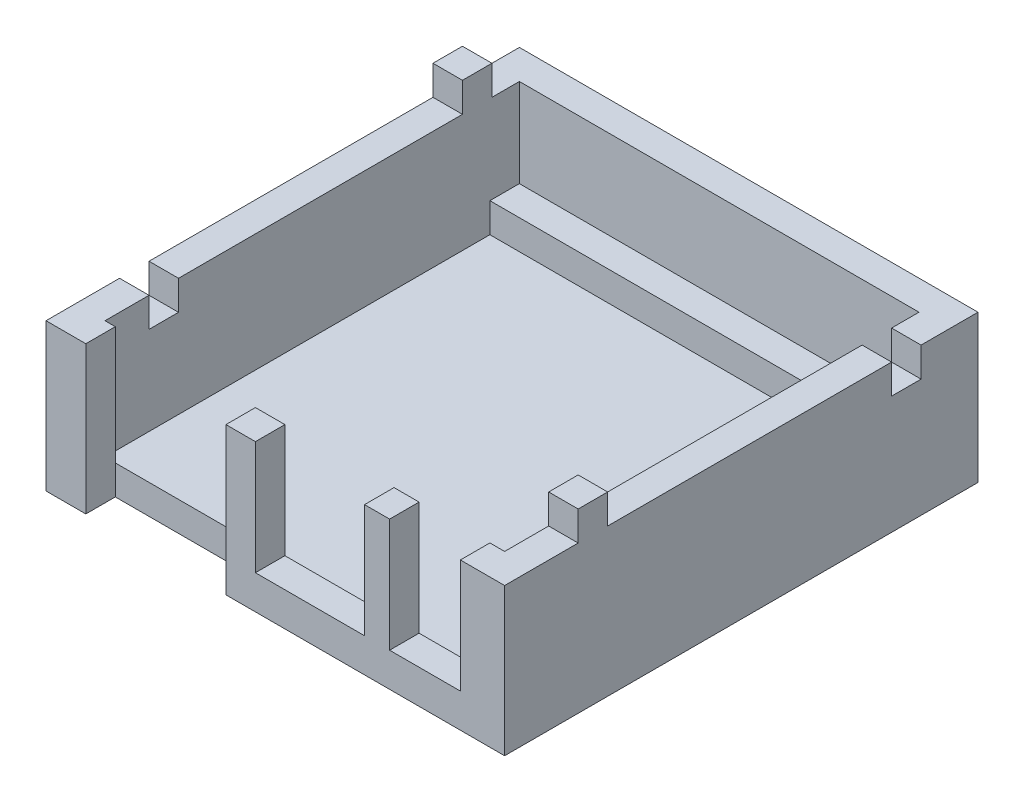
ISO-10303-21;
HEADER;
FILE_DESCRIPTION(('STEP AP214'),'2;1');
FILE_NAME('part.step','',(''),(''),'','','');
FILE_SCHEMA(('AUTOMOTIVE_DESIGN { 1 0 10303 214 1 1 1 1 }'));
ENDSEC;
DATA;
#1=APPLICATION_CONTEXT('core data for automotive mechanical design processes');
#2=APPLICATION_PROTOCOL_DEFINITION('international standard','automotive_design',2000,#1);
#3=PRODUCT_CONTEXT('',#1,'mechanical');
#4=PRODUCT('Part','Part','',(#3));
#5=PRODUCT_RELATED_PRODUCT_CATEGORY('part','',(#4));
#6=PRODUCT_DEFINITION_FORMATION('','',#4);
#7=PRODUCT_DEFINITION_CONTEXT('part definition',#1,'design');
#8=PRODUCT_DEFINITION('design','',#6,#7);
#9=PRODUCT_DEFINITION_SHAPE('','',#8);
#10=(LENGTH_UNIT() NAMED_UNIT(*) SI_UNIT(.MILLI.,.METRE.));
#11=(NAMED_UNIT(*) PLANE_ANGLE_UNIT() SI_UNIT($,.RADIAN.));
#12=(NAMED_UNIT(*) SI_UNIT($,.STERADIAN.) SOLID_ANGLE_UNIT());
#13=UNCERTAINTY_MEASURE_WITH_UNIT(LENGTH_MEASURE(1.E-05),#10,'distance_accuracy_value','');
#14=(GEOMETRIC_REPRESENTATION_CONTEXT(3) GLOBAL_UNCERTAINTY_ASSIGNED_CONTEXT((#13)) GLOBAL_UNIT_ASSIGNED_CONTEXT((#10,
#11,#12)) REPRESENTATION_CONTEXT('',''));
#15=CARTESIAN_POINT('',(0.,0.,0.));
#16=DIRECTION('',(0.,0.,1.));
#17=DIRECTION('',(1.,0.,0.));
#18=AXIS2_PLACEMENT_3D('',#15,#16,#17);
#19=CARTESIAN_POINT('',(0.,10.,0.));
#20=DIRECTION('',(0.,1.,0.));
#21=DIRECTION('',(0.,0.,1.));
#22=AXIS2_PLACEMENT_3D('',#19,#20,#21);
#23=PLANE('',#22);
#24=DIRECTION('',(-1.,0.,0.));
#25=VECTOR('',#24,1.);
#26=CARTESIAN_POINT('',(0.,10.,25.1129881214165));
#27=LINE('',#26,#25);
#28=CARTESIAN_POINT('',(2.,10.,25.1129881214165));
#29=VERTEX_POINT('',#28);
#30=CARTESIAN_POINT('',(0.,10.,25.1129881214165));
#31=VERTEX_POINT('',#30);
#32=EDGE_CURVE('E329',#29,#31,#27,.T.);
#33=ORIENTED_EDGE('',*,*,#32,.F.);
#34=DIRECTION('',(0.,0.,1.));
#35=VECTOR('',#34,1.);
#36=CARTESIAN_POINT('',(2.,10.,4.));
#37=LINE('',#36,#35);
#38=CARTESIAN_POINT('',(2.,10.,5.85974229873187));
#39=VERTEX_POINT('',#38);
#40=EDGE_CURVE('E570',#39,#29,#37,.T.);
#41=ORIENTED_EDGE('',*,*,#40,.F.);
#42=DIRECTION('',(1.,0.,0.));
#43=VECTOR('',#42,1.);
#44=CARTESIAN_POINT('',(0.,10.,5.85974229873187));
#45=LINE('',#44,#43);
#46=CARTESIAN_POINT('',(0.,10.,5.85974229873187));
#47=VERTEX_POINT('',#46);
#48=EDGE_CURVE('E374',#47,#39,#45,.T.);
#49=ORIENTED_EDGE('',*,*,#48,.F.);
#50=DIRECTION('',(0.,0.,1.));
#51=VECTOR('',#50,1.);
#52=CARTESIAN_POINT('',(0.,10.,0.));
#53=LINE('',#52,#51);
#54=EDGE_CURVE('E607',#47,#31,#53,.T.);
#55=ORIENTED_EDGE('',*,*,#54,.T.);
#56=EDGE_LOOP('',(#33,#41,#49,#55));
#57=FACE_BOUND('',#56,.T.);
#58=ADVANCED_FACE('F42',(#57),#23,.T.);
#59=DIRECTION('',(-1.,0.,0.));
#60=VECTOR('',#59,1.);
#61=CARTESIAN_POINT('',(29.1,10.,3.85974229873187));
#62=LINE('',#61,#60);
#63=CARTESIAN_POINT('',(31.1,10.,3.85974229873187));
#64=VERTEX_POINT('',#63);
#65=CARTESIAN_POINT('',(29.1,10.,3.85974229873187));
#66=VERTEX_POINT('',#65);
#67=EDGE_CURVE('E311',#64,#66,#62,.T.);
#68=ORIENTED_EDGE('',*,*,#67,.F.);
#69=DIRECTION('',(0.,0.,-1.));
#70=VECTOR('',#69,1.);
#71=CARTESIAN_POINT('',(31.1,10.,0.));
#72=LINE('',#71,#70);
#73=CARTESIAN_POINT('',(31.1,10.,0.));
#74=VERTEX_POINT('',#73);
#75=EDGE_CURVE('E613',#64,#74,#72,.T.);
#76=ORIENTED_EDGE('',*,*,#75,.T.);
#77=DIRECTION('',(-1.,0.,0.));
#78=VECTOR('',#77,1.);
#79=CARTESIAN_POINT('',(0.,10.,0.));
#80=LINE('',#79,#78);
#81=CARTESIAN_POINT('',(0.,10.,0.));
#82=VERTEX_POINT('',#81);
#83=EDGE_CURVE('E619',#74,#82,#80,.T.);
#84=ORIENTED_EDGE('',*,*,#83,.T.);
#85=CARTESIAN_POINT('',(0.,10.,3.85974229873187));
#86=VERTEX_POINT('',#85);
#87=EDGE_CURVE('E602',#82,#86,#53,.T.);
#88=ORIENTED_EDGE('',*,*,#87,.T.);
#89=DIRECTION('',(-1.,0.,0.));
#90=VECTOR('',#89,1.);
#91=CARTESIAN_POINT('',(0.,10.,3.85974229873187));
#92=LINE('',#91,#90);
#93=CARTESIAN_POINT('',(2.,10.,3.85974229873187));
#94=VERTEX_POINT('',#93);
#95=EDGE_CURVE('E364',#94,#86,#92,.T.);
#96=ORIENTED_EDGE('',*,*,#95,.F.);
#97=CARTESIAN_POINT('',(2.,10.,2.));
#98=VERTEX_POINT('',#97);
#99=EDGE_CURVE('E565',#98,#94,#37,.T.);
#100=ORIENTED_EDGE('',*,*,#99,.F.);
#101=DIRECTION('',(-1.,0.,0.));
#102=VECTOR('',#101,1.);
#103=CARTESIAN_POINT('',(2.,10.,2.));
#104=LINE('',#103,#102);
#105=CARTESIAN_POINT('',(29.1,10.,2.));
#106=VERTEX_POINT('',#105);
#107=EDGE_CURVE('E462',#106,#98,#104,.T.);
#108=ORIENTED_EDGE('',*,*,#107,.F.);
#109=DIRECTION('',(0.,0.,-1.));
#110=VECTOR('',#109,1.);
#111=CARTESIAN_POINT('',(29.1,10.,4.));
#112=LINE('',#111,#110);
#113=EDGE_CURVE('E575',#66,#106,#112,.T.);
#114=ORIENTED_EDGE('',*,*,#113,.F.);
#115=EDGE_LOOP('',(#68,#76,#84,#88,#96,#100,#108,#114));
#116=FACE_BOUND('',#115,.T.);
#117=ADVANCED_FACE('F674',(#116),#23,.T.);
#118=DIRECTION('',(1.,0.,0.));
#119=VECTOR('',#118,1.);
#120=CARTESIAN_POINT('',(0.,10.,27.1129881214165));
#121=LINE('',#120,#119);
#122=CARTESIAN_POINT('',(0.,10.,27.1129881214165));
#123=VERTEX_POINT('',#122);
#124=CARTESIAN_POINT('',(2.,10.,27.1129881214165));
#125=VERTEX_POINT('',#124);
#126=EDGE_CURVE('E340',#123,#125,#121,.T.);
#127=ORIENTED_EDGE('',*,*,#126,.F.);
#128=CARTESIAN_POINT('',(0.,10.,32.1));
#129=VERTEX_POINT('',#128);
#130=EDGE_CURVE('E608',#123,#129,#53,.T.);
#131=ORIENTED_EDGE('',*,*,#130,.T.);
#132=DIRECTION('',(1.,0.,0.));
#133=VECTOR('',#132,1.);
#134=CARTESIAN_POINT('',(0.,10.,32.1));
#135=LINE('',#134,#133);
#136=CARTESIAN_POINT('',(2.7,9.99999999999999,32.1));
#137=VERTEX_POINT('',#136);
#138=EDGE_CURVE('E609',#129,#137,#135,.T.);
#139=ORIENTED_EDGE('',*,*,#138,.T.);
#140=DIRECTION('',(0.,0.,1.));
#141=VECTOR('',#140,1.);
#142=CARTESIAN_POINT('',(2.7,9.99999999999999,16.3068857758663));
#143=LINE('',#142,#141);
#144=CARTESIAN_POINT('',(2.7,9.99999999999999,30.1));
#145=VERTEX_POINT('',#144);
#146=EDGE_CURVE('E522',#145,#137,#143,.T.);
#147=ORIENTED_EDGE('',*,*,#146,.F.);
#148=DIRECTION('',(1.,0.,0.));
#149=VECTOR('',#148,1.);
#150=CARTESIAN_POINT('',(2.,10.,30.1));
#151=LINE('',#150,#149);
#152=CARTESIAN_POINT('',(2.,10.,30.1));
#153=VERTEX_POINT('',#152);
#154=EDGE_CURVE('E571',#153,#145,#151,.T.);
#155=ORIENTED_EDGE('',*,*,#154,.F.);
#156=EDGE_CURVE('E553',#125,#153,#37,.T.);
#157=ORIENTED_EDGE('',*,*,#156,.F.);
#158=EDGE_LOOP('',(#127,#131,#139,#147,#155,#157));
#159=FACE_BOUND('',#158,.T.);
#160=ADVANCED_FACE('F779',(#159),#23,.T.);
#161=DIRECTION('',(1.,0.,0.));
#162=VECTOR('',#161,1.);
#163=CARTESIAN_POINT('',(29.1,10.,5.85974229873187));
#164=LINE('',#163,#162);
#165=CARTESIAN_POINT('',(29.1,10.,5.85974229873187));
#166=VERTEX_POINT('',#165);
#167=CARTESIAN_POINT('',(31.1,10.,5.85974229873187));
#168=VERTEX_POINT('',#167);
#169=EDGE_CURVE('E349',#166,#168,#164,.T.);
#170=ORIENTED_EDGE('',*,*,#169,.F.);
#171=CARTESIAN_POINT('',(29.1,10.,25.1129881214165));
#172=VERTEX_POINT('',#171);
#173=EDGE_CURVE('E316',#172,#166,#112,.T.);
#174=ORIENTED_EDGE('',*,*,#173,.F.);
#175=DIRECTION('',(-1.,0.,0.));
#176=VECTOR('',#175,1.);
#177=CARTESIAN_POINT('',(29.1,10.,25.1129881214165));
#178=LINE('',#177,#176);
#179=CARTESIAN_POINT('',(31.1,10.,25.1129881214165));
#180=VERTEX_POINT('',#179);
#181=EDGE_CURVE('E399',#180,#172,#178,.T.);
#182=ORIENTED_EDGE('',*,*,#181,.F.);
#183=EDGE_CURVE('E620',#180,#168,#72,.T.);
#184=ORIENTED_EDGE('',*,*,#183,.T.);
#185=EDGE_LOOP('',(#170,#174,#182,#184));
#186=FACE_BOUND('',#185,.T.);
#187=ADVANCED_FACE('F683',(#186),#23,.T.);
#188=CARTESIAN_POINT('',(31.1,10.,32.1));
#189=VERTEX_POINT('',#188);
#190=CARTESIAN_POINT('',(31.1,10.,27.1129881214165));
#191=VERTEX_POINT('',#190);
#192=EDGE_CURVE('E615',#189,#191,#72,.T.);
#193=ORIENTED_EDGE('',*,*,#192,.T.);
#194=DIRECTION('',(1.,0.,0.));
#195=VECTOR('',#194,1.);
#196=CARTESIAN_POINT('',(29.1,10.,27.1129881214165));
#197=LINE('',#196,#195);
#198=CARTESIAN_POINT('',(29.1,10.,27.1129881214165));
#199=VERTEX_POINT('',#198);
#200=EDGE_CURVE('E393',#199,#191,#197,.T.);
#201=ORIENTED_EDGE('',*,*,#200,.F.);
#202=CARTESIAN_POINT('',(29.1,10.,30.1));
#203=VERTEX_POINT('',#202);
#204=EDGE_CURVE('E577',#203,#199,#112,.T.);
#205=ORIENTED_EDGE('',*,*,#204,.F.);
#206=CARTESIAN_POINT('',(28.1,10.,30.1));
#207=VERTEX_POINT('',#206);
#208=EDGE_CURVE('E569',#207,#203,#151,.T.);
#209=ORIENTED_EDGE('',*,*,#208,.F.);
#210=DIRECTION('',(0.,0.,1.));
#211=VECTOR('',#210,1.);
#212=CARTESIAN_POINT('',(28.1,10.,16.3068857758663));
#213=LINE('',#212,#211);
#214=CARTESIAN_POINT('',(28.1,10.,32.1));
#215=VERTEX_POINT('',#214);
#216=EDGE_CURVE('E451',#207,#215,#213,.T.);
#217=ORIENTED_EDGE('',*,*,#216,.T.);
#218=EDGE_CURVE('E606',#215,#189,#135,.T.);
#219=ORIENTED_EDGE('',*,*,#218,.T.);
#220=EDGE_LOOP('',(#193,#201,#205,#209,#217,#219));
#221=FACE_BOUND('',#220,.T.);
#222=ADVANCED_FACE('F753',(#221),#23,.T.);
#223=CARTESIAN_POINT('',(0.,10.,32.1));
#224=DIRECTION('',(0.,0.,-1.));
#225=DIRECTION('',(-1.,0.,0.));
#226=AXIS2_PLACEMENT_3D('',#223,#224,#225);
#227=PLANE('',#226);
#228=DIRECTION('',(1.,0.,0.));
#229=VECTOR('',#228,1.);
#230=CARTESIAN_POINT('',(23.3,2.3,32.1));
#231=LINE('',#230,#229);
#232=CARTESIAN_POINT('',(23.3,2.3,32.1));
#233=VERTEX_POINT('',#232);
#234=CARTESIAN_POINT('',(28.1,2.3,32.1));
#235=VERTEX_POINT('',#234);
#236=EDGE_CURVE('E440',#233,#235,#231,.T.);
#237=ORIENTED_EDGE('',*,*,#236,.F.);
#238=DIRECTION('',(0.,-1.,0.));
#239=VECTOR('',#238,1.);
#240=CARTESIAN_POINT('',(23.3,10.,32.1));
#241=LINE('',#240,#239);
#242=CARTESIAN_POINT('',(23.3,10.,32.1));
#243=VERTEX_POINT('',#242);
#244=EDGE_CURVE('E436',#243,#233,#241,.T.);
#245=ORIENTED_EDGE('',*,*,#244,.F.);
#246=CARTESIAN_POINT('',(21.6,10.,32.1));
#247=VERTEX_POINT('',#246);
#248=EDGE_CURVE('E710',#247,#243,#135,.T.);
#249=ORIENTED_EDGE('',*,*,#248,.F.);
#250=DIRECTION('',(0.,1.,0.));
#251=VECTOR('',#250,1.);
#252=CARTESIAN_POINT('',(21.6,2.3,32.1));
#253=LINE('',#252,#251);
#254=CARTESIAN_POINT('',(21.6,2.3,32.1));
#255=VERTEX_POINT('',#254);
#256=EDGE_CURVE('E480',#255,#247,#253,.T.);
#257=ORIENTED_EDGE('',*,*,#256,.F.);
#258=DIRECTION('',(1.,0.,0.));
#259=VECTOR('',#258,1.);
#260=CARTESIAN_POINT('',(14.2,2.3,32.1));
#261=LINE('',#260,#259);
#262=CARTESIAN_POINT('',(14.2,2.3,32.1));
#263=VERTEX_POINT('',#262);
#264=EDGE_CURVE('E475',#263,#255,#261,.T.);
#265=ORIENTED_EDGE('',*,*,#264,.F.);
#266=DIRECTION('',(0.,-1.,0.));
#267=VECTOR('',#266,1.);
#268=CARTESIAN_POINT('',(14.2,2.3,32.1));
#269=LINE('',#268,#267);
#270=CARTESIAN_POINT('',(14.2,10.,32.1));
#271=VERTEX_POINT('',#270);
#272=EDGE_CURVE('E471',#271,#263,#269,.T.);
#273=ORIENTED_EDGE('',*,*,#272,.F.);
#274=CARTESIAN_POINT('',(12.2,10.,32.1));
#275=VERTEX_POINT('',#274);
#276=EDGE_CURVE('E614',#275,#271,#135,.T.);
#277=ORIENTED_EDGE('',*,*,#276,.F.);
#278=DIRECTION('',(0.,1.,0.));
#279=VECTOR('',#278,1.);
#280=CARTESIAN_POINT('',(12.2,0.,32.1));
#281=LINE('',#280,#279);
#282=CARTESIAN_POINT('',(12.2,0.,32.1));
#283=VERTEX_POINT('',#282);
#284=EDGE_CURVE('E426',#283,#275,#281,.T.);
#285=ORIENTED_EDGE('',*,*,#284,.F.);
#286=DIRECTION('',(1.,0.,0.));
#287=VECTOR('',#286,1.);
#288=CARTESIAN_POINT('',(0.,0.,32.1));
#289=LINE('',#288,#287);
#290=CARTESIAN_POINT('',(31.1,0.,32.1));
#291=VERTEX_POINT('',#290);
#292=EDGE_CURVE('E627',#283,#291,#289,.T.);
#293=ORIENTED_EDGE('',*,*,#292,.T.);
#294=DIRECTION('',(0.,-1.,0.));
#295=VECTOR('',#294,1.);
#296=CARTESIAN_POINT('',(31.1,10.,32.1));
#297=LINE('',#296,#295);
#298=EDGE_CURVE('E51',#189,#291,#297,.T.);
#299=ORIENTED_EDGE('',*,*,#298,.F.);
#300=ORIENTED_EDGE('',*,*,#218,.F.);
#301=DIRECTION('',(0.,1.,0.));
#302=VECTOR('',#301,1.);
#303=CARTESIAN_POINT('',(28.1,2.3,32.1));
#304=LINE('',#303,#302);
#305=EDGE_CURVE('E445',#235,#215,#304,.T.);
#306=ORIENTED_EDGE('',*,*,#305,.F.);
#307=EDGE_LOOP('',(#237,#245,#249,#257,#265,#273,#277,#285,#293,#299,#300,#306));
#308=FACE_BOUND('',#307,.T.);
#309=ADVANCED_FACE('F723',(#308),#227,.F.);
#310=DIRECTION('',(0.,0.,1.));
#311=VECTOR('',#310,1.);
#312=CARTESIAN_POINT('',(23.3,10.,16.3068857758663));
#313=LINE('',#312,#311);
#314=CARTESIAN_POINT('',(23.3,10.,30.1));
#315=VERTEX_POINT('',#314);
#316=EDGE_CURVE('E432',#315,#243,#313,.T.);
#317=ORIENTED_EDGE('',*,*,#316,.F.);
#318=CARTESIAN_POINT('',(21.6,10.,30.1));
#319=VERTEX_POINT('',#318);
#320=EDGE_CURVE('E737',#319,#315,#151,.T.);
#321=ORIENTED_EDGE('',*,*,#320,.F.);
#322=DIRECTION('',(0.,0.,1.));
#323=VECTOR('',#322,1.);
#324=CARTESIAN_POINT('',(21.6,10.,16.3068857758663));
#325=LINE('',#324,#323);
#326=EDGE_CURVE('E486',#319,#247,#325,.T.);
#327=ORIENTED_EDGE('',*,*,#326,.T.);
#328=ORIENTED_EDGE('',*,*,#248,.T.);
#329=EDGE_LOOP('',(#317,#321,#327,#328));
#330=FACE_BOUND('',#329,.T.);
#331=ADVANCED_FACE('F788',(#330),#23,.T.);
#332=DIRECTION('',(0.,0.,1.));
#333=VECTOR('',#332,1.);
#334=CARTESIAN_POINT('',(14.2,10.,16.3068857758663));
#335=LINE('',#334,#333);
#336=CARTESIAN_POINT('',(14.2,10.,30.1));
#337=VERTEX_POINT('',#336);
#338=EDGE_CURVE('E468',#337,#271,#335,.T.);
#339=ORIENTED_EDGE('',*,*,#338,.F.);
#340=CARTESIAN_POINT('',(12.2,10.,30.1));
#341=VERTEX_POINT('',#340);
#342=EDGE_CURVE('E576',#341,#337,#151,.T.);
#343=ORIENTED_EDGE('',*,*,#342,.F.);
#344=DIRECTION('',(0.,0.,1.));
#345=VECTOR('',#344,1.);
#346=CARTESIAN_POINT('',(12.2,10.,16.3068857758663));
#347=LINE('',#346,#345);
#348=EDGE_CURVE('E514',#341,#275,#347,.T.);
#349=ORIENTED_EDGE('',*,*,#348,.T.);
#350=ORIENTED_EDGE('',*,*,#276,.T.);
#351=EDGE_LOOP('',(#339,#343,#349,#350));
#352=FACE_BOUND('',#351,.T.);
#353=ADVANCED_FACE('F717',(#352),#23,.T.);
#354=CARTESIAN_POINT('',(2.,-37.6247259126229,30.1));
#355=DIRECTION('',(0.,0.,1.));
#356=DIRECTION('',(1.,0.,0.));
#357=AXIS2_PLACEMENT_3D('',#354,#355,#356);
#358=PLANE('',#357);
#359=ORIENTED_EDGE('',*,*,#320,.T.);
#360=DIRECTION('',(0.,1.,0.));
#361=VECTOR('',#360,1.);
#362=CARTESIAN_POINT('',(23.3,10.,30.1));
#363=LINE('',#362,#361);
#364=CARTESIAN_POINT('',(23.3,2.3,30.1));
#365=VERTEX_POINT('',#364);
#366=EDGE_CURVE('E431',#365,#315,#363,.T.);
#367=ORIENTED_EDGE('',*,*,#366,.F.);
#368=DIRECTION('',(-1.,0.,0.));
#369=VECTOR('',#368,1.);
#370=CARTESIAN_POINT('',(23.3,2.3,30.1));
#371=LINE('',#370,#369);
#372=CARTESIAN_POINT('',(28.1,2.3,30.1));
#373=VERTEX_POINT('',#372);
#374=EDGE_CURVE('E435',#373,#365,#371,.T.);
#375=ORIENTED_EDGE('',*,*,#374,.F.);
#376=DIRECTION('',(0.,-1.,0.));
#377=VECTOR('',#376,1.);
#378=CARTESIAN_POINT('',(28.1,2.3,30.1));
#379=LINE('',#378,#377);
#380=EDGE_CURVE('E427',#207,#373,#379,.T.);
#381=ORIENTED_EDGE('',*,*,#380,.F.);
#382=ORIENTED_EDGE('',*,*,#208,.T.);
#383=DIRECTION('',(0.,1.,0.));
#384=VECTOR('',#383,1.);
#385=CARTESIAN_POINT('',(29.1,-37.6247259126229,30.1));
#386=LINE('',#385,#384);
#387=CARTESIAN_POINT('',(29.1,2.,30.1));
#388=VERTEX_POINT('',#387);
#389=EDGE_CURVE('E589',#388,#203,#386,.T.);
#390=ORIENTED_EDGE('',*,*,#389,.F.);
#391=DIRECTION('',(-1.,0.,0.));
#392=VECTOR('',#391,1.);
#393=CARTESIAN_POINT('',(2.,2.,30.1));
#394=LINE('',#393,#392);
#395=CARTESIAN_POINT('',(12.2,2.,30.1));
#396=VERTEX_POINT('',#395);
#397=EDGE_CURVE('E596',#388,#396,#394,.T.);
#398=ORIENTED_EDGE('',*,*,#397,.T.);
#399=DIRECTION('',(0.,-1.,0.));
#400=VECTOR('',#399,1.);
#401=CARTESIAN_POINT('',(12.2,0.,30.1));
#402=LINE('',#401,#400);
#403=EDGE_CURVE('E476',#341,#396,#402,.T.);
#404=ORIENTED_EDGE('',*,*,#403,.F.);
#405=ORIENTED_EDGE('',*,*,#342,.T.);
#406=DIRECTION('',(0.,1.,0.));
#407=VECTOR('',#406,1.);
#408=CARTESIAN_POINT('',(14.2,2.3,30.1));
#409=LINE('',#408,#407);
#410=CARTESIAN_POINT('',(14.2,2.3,30.1));
#411=VERTEX_POINT('',#410);
#412=EDGE_CURVE('E467',#411,#337,#409,.T.);
#413=ORIENTED_EDGE('',*,*,#412,.F.);
#414=DIRECTION('',(-1.,0.,0.));
#415=VECTOR('',#414,1.);
#416=CARTESIAN_POINT('',(14.2,2.3,30.1));
#417=LINE('',#416,#415);
#418=CARTESIAN_POINT('',(21.6,2.3,30.1));
#419=VERTEX_POINT('',#418);
#420=EDGE_CURVE('E441',#419,#411,#417,.T.);
#421=ORIENTED_EDGE('',*,*,#420,.F.);
#422=DIRECTION('',(0.,-1.,0.));
#423=VECTOR('',#422,1.);
#424=CARTESIAN_POINT('',(21.6,2.3,30.1));
#425=LINE('',#424,#423);
#426=EDGE_CURVE('E463',#319,#419,#425,.T.);
#427=ORIENTED_EDGE('',*,*,#426,.F.);
#428=EDGE_LOOP('',(#359,#367,#375,#381,#382,#390,#398,#404,#405,#413,#421,#427));
#429=FACE_BOUND('',#428,.T.);
#430=ADVANCED_FACE('F733',(#429),#358,.F.);
#431=CARTESIAN_POINT('',(2.,-37.6247259126229,4.));
#432=DIRECTION('',(0.,0.,-1.));
#433=DIRECTION('',(-1.,0.,0.));
#434=AXIS2_PLACEMENT_3D('',#431,#432,#433);
#435=PLANE('',#434);
#436=DIRECTION('',(-1.,0.,0.));
#437=VECTOR('',#436,1.);
#438=CARTESIAN_POINT('',(2.,4.,4.));
#439=LINE('',#438,#437);
#440=CARTESIAN_POINT('',(29.1,4.,4.));
#441=VERTEX_POINT('',#440);
#442=CARTESIAN_POINT('',(2.,4.,4.));
#443=VERTEX_POINT('',#442);
#444=EDGE_CURVE('E539',#441,#443,#439,.T.);
#445=ORIENTED_EDGE('',*,*,#444,.T.);
#446=DIRECTION('',(0.,1.,0.));
#447=VECTOR('',#446,1.);
#448=CARTESIAN_POINT('',(2.,-37.6247259126229,4.));
#449=LINE('',#448,#447);
#450=CARTESIAN_POINT('',(2.,2.,4.));
#451=VERTEX_POINT('',#450);
#452=EDGE_CURVE('E558',#451,#443,#449,.T.);
#453=ORIENTED_EDGE('',*,*,#452,.F.);
#454=DIRECTION('',(1.,0.,0.));
#455=VECTOR('',#454,1.);
#456=CARTESIAN_POINT('',(2.,2.,4.));
#457=LINE('',#456,#455);
#458=CARTESIAN_POINT('',(29.1,2.,4.));
#459=VERTEX_POINT('',#458);
#460=EDGE_CURVE('E557',#451,#459,#457,.T.);
#461=ORIENTED_EDGE('',*,*,#460,.T.);
#462=DIRECTION('',(0.,1.,0.));
#463=VECTOR('',#462,1.);
#464=CARTESIAN_POINT('',(29.1,-37.6247259126229,4.));
#465=LINE('',#464,#463);
#466=EDGE_CURVE('E585',#459,#441,#465,.T.);
#467=ORIENTED_EDGE('',*,*,#466,.T.);
#468=EDGE_LOOP('',(#445,#453,#461,#467));
#469=FACE_BOUND('',#468,.T.);
#470=ADVANCED_FACE('F795',(#469),#435,.F.);
#471=CARTESIAN_POINT('',(0.,10.,0.));
#472=DIRECTION('',(1.,0.,0.));
#473=DIRECTION('',(0.,0.,-1.));
#474=AXIS2_PLACEMENT_3D('',#471,#472,#473);
#475=PLANE('',#474);
#476=DIRECTION('',(0.,0.,1.));
#477=VECTOR('',#476,1.);
#478=CARTESIAN_POINT('',(0.,8.,25.1129881214165));
#479=LINE('',#478,#477);
#480=CARTESIAN_POINT('',(0.,8.,25.1129881214165));
#481=VERTEX_POINT('',#480);
#482=CARTESIAN_POINT('',(0.,8.,27.1129881214165));
#483=VERTEX_POINT('',#482);
#484=EDGE_CURVE('E326',#481,#483,#479,.T.);
#485=ORIENTED_EDGE('',*,*,#484,.F.);
#486=DIRECTION('',(0.,1.,0.));
#487=VECTOR('',#486,1.);
#488=CARTESIAN_POINT('',(0.,8.,25.1129881214165));
#489=LINE('',#488,#487);
#490=EDGE_CURVE('E345',#481,#31,#489,.T.);
#491=ORIENTED_EDGE('',*,*,#490,.T.);
#492=ORIENTED_EDGE('',*,*,#54,.F.);
#493=DIRECTION('',(0.,-1.,0.));
#494=VECTOR('',#493,1.);
#495=CARTESIAN_POINT('',(0.,12.,5.85974229873187));
#496=LINE('',#495,#494);
#497=CARTESIAN_POINT('',(0.,12.,5.85974229873187));
#498=VERTEX_POINT('',#497);
#499=EDGE_CURVE('E390',#498,#47,#496,.T.);
#500=ORIENTED_EDGE('',*,*,#499,.F.);
#501=DIRECTION('',(0.,0.,1.));
#502=VECTOR('',#501,1.);
#503=CARTESIAN_POINT('',(0.,12.,3.85974229873187));
#504=LINE('',#503,#502);
#505=CARTESIAN_POINT('',(0.,12.,3.85974229873187));
#506=VERTEX_POINT('',#505);
#507=EDGE_CURVE('E359',#506,#498,#504,.T.);
#508=ORIENTED_EDGE('',*,*,#507,.F.);
#509=DIRECTION('',(0.,-1.,0.));
#510=VECTOR('',#509,1.);
#511=CARTESIAN_POINT('',(0.,12.,3.85974229873187));
#512=LINE('',#511,#510);
#513=EDGE_CURVE('E373',#506,#86,#512,.T.);
#514=ORIENTED_EDGE('',*,*,#513,.T.);
#515=ORIENTED_EDGE('',*,*,#87,.F.);
#516=DIRECTION('',(0.,-1.,0.));
#517=VECTOR('',#516,1.);
#518=CARTESIAN_POINT('',(0.,10.,0.));
#519=LINE('',#518,#517);
#520=CARTESIAN_POINT('',(0.,0.,0.));
#521=VERTEX_POINT('',#520);
#522=EDGE_CURVE('E623',#82,#521,#519,.T.);
#523=ORIENTED_EDGE('',*,*,#522,.T.);
#524=DIRECTION('',(0.,0.,1.));
#525=VECTOR('',#524,1.);
#526=CARTESIAN_POINT('',(0.,0.,0.));
#527=LINE('',#526,#525);
#528=CARTESIAN_POINT('',(0.,0.,32.1));
#529=VERTEX_POINT('',#528);
#530=EDGE_CURVE('E600',#521,#529,#527,.T.);
#531=ORIENTED_EDGE('',*,*,#530,.T.);
#532=DIRECTION('',(0.,-1.,0.));
#533=VECTOR('',#532,1.);
#534=CARTESIAN_POINT('',(0.,10.,32.1));
#535=LINE('',#534,#533);
#536=EDGE_CURVE('E13',#129,#529,#535,.T.);
#537=ORIENTED_EDGE('',*,*,#536,.F.);
#538=ORIENTED_EDGE('',*,*,#130,.F.);
#539=DIRECTION('',(0.,1.,0.));
#540=VECTOR('',#539,1.);
#541=CARTESIAN_POINT('',(0.,8.,27.1129881214165));
#542=LINE('',#541,#540);
#543=EDGE_CURVE('E339',#483,#123,#542,.T.);
#544=ORIENTED_EDGE('',*,*,#543,.F.);
#545=EDGE_LOOP('',(#485,#491,#492,#500,#508,#514,#515,#523,#531,#537,#538,#544));
#546=FACE_BOUND('',#545,.T.);
#547=ADVANCED_FACE('F44',(#546),#475,.F.);
#548=CARTESIAN_POINT('',(2.7,0.,32.1));
#549=VERTEX_POINT('',#548);
#550=EDGE_CURVE('E628',#529,#549,#289,.T.);
#551=ORIENTED_EDGE('',*,*,#550,.T.);
#552=DIRECTION('',(0.,-1.,0.));
#553=VECTOR('',#552,1.);
#554=CARTESIAN_POINT('',(2.7,0.,32.1));
#555=LINE('',#554,#553);
#556=EDGE_CURVE('E511',#137,#549,#555,.T.);
#557=ORIENTED_EDGE('',*,*,#556,.F.);
#558=ORIENTED_EDGE('',*,*,#138,.F.);
#559=ORIENTED_EDGE('',*,*,#536,.T.);
#560=EDGE_LOOP('',(#551,#557,#558,#559));
#561=FACE_BOUND('',#560,.T.);
#562=ADVANCED_FACE('F789',(#561),#227,.F.);
#563=CARTESIAN_POINT('',(31.1,10.,0.));
#564=DIRECTION('',(-1.,0.,0.));
#565=DIRECTION('',(0.,0.,1.));
#566=AXIS2_PLACEMENT_3D('',#563,#564,#565);
#567=PLANE('',#566);
#568=ORIENTED_EDGE('',*,*,#75,.F.);
#569=DIRECTION('',(0.,1.,0.));
#570=VECTOR('',#569,1.);
#571=CARTESIAN_POINT('',(31.1,8.,3.85974229873187));
#572=LINE('',#571,#570);
#573=CARTESIAN_POINT('',(31.1,8.,3.85974229873187));
#574=VERTEX_POINT('',#573);
#575=EDGE_CURVE('E321',#574,#64,#572,.T.);
#576=ORIENTED_EDGE('',*,*,#575,.F.);
#577=DIRECTION('',(0.,0.,-1.));
#578=VECTOR('',#577,1.);
#579=CARTESIAN_POINT('',(31.1,8.,3.85974229873187));
#580=LINE('',#579,#578);
#581=CARTESIAN_POINT('',(31.1,8.,5.85974229873187));
#582=VERTEX_POINT('',#581);
#583=EDGE_CURVE('E303',#582,#574,#580,.T.);
#584=ORIENTED_EDGE('',*,*,#583,.F.);
#585=DIRECTION('',(0.,1.,0.));
#586=VECTOR('',#585,1.);
#587=CARTESIAN_POINT('',(31.1,8.,5.85974229873187));
#588=LINE('',#587,#586);
#589=EDGE_CURVE('E300',#582,#168,#588,.T.);
#590=ORIENTED_EDGE('',*,*,#589,.T.);
#591=ORIENTED_EDGE('',*,*,#183,.F.);
#592=DIRECTION('',(0.,-1.,0.));
#593=VECTOR('',#592,1.);
#594=CARTESIAN_POINT('',(31.1,12.,25.1129881214165));
#595=LINE('',#594,#593);
#596=CARTESIAN_POINT('',(31.1,12.,25.1129881214165));
#597=VERTEX_POINT('',#596);
#598=EDGE_CURVE('E416',#597,#180,#595,.T.);
#599=ORIENTED_EDGE('',*,*,#598,.F.);
#600=DIRECTION('',(0.,0.,-1.));
#601=VECTOR('',#600,1.);
#602=CARTESIAN_POINT('',(31.1,12.,25.1129881214165));
#603=LINE('',#602,#601);
#604=CARTESIAN_POINT('',(31.1,12.,27.1129881214165));
#605=VERTEX_POINT('',#604);
#606=EDGE_CURVE('E402',#605,#597,#603,.T.);
#607=ORIENTED_EDGE('',*,*,#606,.F.);
#608=DIRECTION('',(0.,-1.,0.));
#609=VECTOR('',#608,1.);
#610=CARTESIAN_POINT('',(31.1,12.,27.1129881214165));
#611=LINE('',#610,#609);
#612=EDGE_CURVE('E419',#605,#191,#611,.T.);
#613=ORIENTED_EDGE('',*,*,#612,.T.);
#614=ORIENTED_EDGE('',*,*,#192,.F.);
#615=ORIENTED_EDGE('',*,*,#298,.T.);
#616=DIRECTION('',(0.,0.,-1.));
#617=VECTOR('',#616,1.);
#618=CARTESIAN_POINT('',(31.1,0.,0.));
#619=LINE('',#618,#617);
#620=CARTESIAN_POINT('',(31.1,0.,0.));
#621=VERTEX_POINT('',#620);
#622=EDGE_CURVE('E632',#291,#621,#619,.T.);
#623=ORIENTED_EDGE('',*,*,#622,.T.);
#624=DIRECTION('',(0.,-1.,0.));
#625=VECTOR('',#624,1.);
#626=CARTESIAN_POINT('',(31.1,10.,0.));
#627=LINE('',#626,#625);
#628=EDGE_CURVE('E641',#74,#621,#627,.T.);
#629=ORIENTED_EDGE('',*,*,#628,.F.);
#630=EDGE_LOOP('',(#568,#576,#584,#590,#591,#599,#607,#613,#614,#615,#623,#629));
#631=FACE_BOUND('',#630,.T.);
#632=ADVANCED_FACE('F651',(#631),#567,.F.);
#633=CARTESIAN_POINT('',(0.,10.,0.));
#634=DIRECTION('',(0.,0.,1.));
#635=DIRECTION('',(1.,0.,0.));
#636=AXIS2_PLACEMENT_3D('',#633,#634,#635);
#637=PLANE('',#636);
#638=DIRECTION('',(-1.,0.,0.));
#639=VECTOR('',#638,1.);
#640=CARTESIAN_POINT('',(0.,0.,0.));
#641=LINE('',#640,#639);
#642=EDGE_CURVE('E635',#621,#521,#641,.T.);
#643=ORIENTED_EDGE('',*,*,#642,.T.);
#644=ORIENTED_EDGE('',*,*,#522,.F.);
#645=ORIENTED_EDGE('',*,*,#83,.F.);
#646=ORIENTED_EDGE('',*,*,#628,.T.);
#647=EDGE_LOOP('',(#643,#644,#645,#646));
#648=FACE_BOUND('',#647,.T.);
#649=ADVANCED_FACE('F663',(#648),#637,.F.);
#650=CARTESIAN_POINT('',(0.,0.,0.));
#651=DIRECTION('',(0.,1.,0.));
#652=DIRECTION('',(0.,0.,1.));
#653=AXIS2_PLACEMENT_3D('',#650,#651,#652);
#654=PLANE('',#653);
#655=ORIENTED_EDGE('',*,*,#292,.F.);
#656=DIRECTION('',(0.,0.,1.));
#657=VECTOR('',#656,1.);
#658=CARTESIAN_POINT('',(12.2,0.,16.3068857758663));
#659=LINE('',#658,#657);
#660=CARTESIAN_POINT('',(12.2,0.,30.1));
#661=VERTEX_POINT('',#660);
#662=EDGE_CURVE('E515',#661,#283,#659,.T.);
#663=ORIENTED_EDGE('',*,*,#662,.F.);
#664=DIRECTION('',(-1.,0.,0.));
#665=VECTOR('',#664,1.);
#666=CARTESIAN_POINT('',(12.2,0.,30.1));
#667=LINE('',#666,#665);
#668=CARTESIAN_POINT('',(2.7,0.,30.1));
#669=VERTEX_POINT('',#668);
#670=EDGE_CURVE('E501',#661,#669,#667,.T.);
#671=ORIENTED_EDGE('',*,*,#670,.T.);
#672=DIRECTION('',(0.,0.,1.));
#673=VECTOR('',#672,1.);
#674=CARTESIAN_POINT('',(2.7,0.,16.3068857758663));
#675=LINE('',#674,#673);
#676=EDGE_CURVE('E518',#669,#549,#675,.T.);
#677=ORIENTED_EDGE('',*,*,#676,.T.);
#678=ORIENTED_EDGE('',*,*,#550,.F.);
#679=ORIENTED_EDGE('',*,*,#530,.F.);
#680=ORIENTED_EDGE('',*,*,#642,.F.);
#681=ORIENTED_EDGE('',*,*,#622,.F.);
#682=EDGE_LOOP('',(#655,#663,#671,#677,#678,#679,#680,#681));
#683=FACE_BOUND('',#682,.T.);
#684=ADVANCED_FACE('F658',(#683),#654,.F.);
#685=CARTESIAN_POINT('',(2.,-37.6247259126229,4.));
#686=DIRECTION('',(-1.,0.,0.));
#687=DIRECTION('',(0.,0.,1.));
#688=AXIS2_PLACEMENT_3D('',#685,#686,#687);
#689=PLANE('',#688);
#690=ORIENTED_EDGE('',*,*,#40,.T.);
#691=DIRECTION('',(0.,1.,0.));
#692=VECTOR('',#691,1.);
#693=CARTESIAN_POINT('',(2.,8.,25.1129881214165));
#694=LINE('',#693,#692);
#695=CARTESIAN_POINT('',(2.,8.,25.1129881214165));
#696=VERTEX_POINT('',#695);
#697=EDGE_CURVE('E350',#696,#29,#694,.T.);
#698=ORIENTED_EDGE('',*,*,#697,.F.);
#699=DIRECTION('',(0.,0.,-1.));
#700=VECTOR('',#699,1.);
#701=CARTESIAN_POINT('',(2.,8.,25.1129881214165));
#702=LINE('',#701,#700);
#703=CARTESIAN_POINT('',(2.,8.,27.1129881214165));
#704=VERTEX_POINT('',#703);
#705=EDGE_CURVE('E332',#704,#696,#702,.T.);
#706=ORIENTED_EDGE('',*,*,#705,.F.);
#707=DIRECTION('',(0.,1.,0.));
#708=VECTOR('',#707,1.);
#709=CARTESIAN_POINT('',(2.,8.,27.1129881214165));
#710=LINE('',#709,#708);
#711=EDGE_CURVE('E353',#704,#125,#710,.T.);
#712=ORIENTED_EDGE('',*,*,#711,.T.);
#713=ORIENTED_EDGE('',*,*,#156,.T.);
#714=DIRECTION('',(0.,1.,0.));
#715=VECTOR('',#714,1.);
#716=CARTESIAN_POINT('',(2.,-37.6247259126229,30.1));
#717=LINE('',#716,#715);
#718=CARTESIAN_POINT('',(2.,2.,30.1));
#719=VERTEX_POINT('',#718);
#720=EDGE_CURVE('E581',#719,#153,#717,.T.);
#721=ORIENTED_EDGE('',*,*,#720,.F.);
#722=DIRECTION('',(0.,0.,-1.));
#723=VECTOR('',#722,1.);
#724=CARTESIAN_POINT('',(2.,2.,4.));
#725=LINE('',#724,#723);
#726=EDGE_CURVE('E561',#719,#451,#725,.T.);
#727=ORIENTED_EDGE('',*,*,#726,.T.);
#728=ORIENTED_EDGE('',*,*,#452,.T.);
#729=DIRECTION('',(0.,0.,-1.));
#730=VECTOR('',#729,1.);
#731=CARTESIAN_POINT('',(2.,4.,4.));
#732=LINE('',#731,#730);
#733=CARTESIAN_POINT('',(2.,4.,2.));
#734=VERTEX_POINT('',#733);
#735=EDGE_CURVE('E536',#443,#734,#732,.T.);
#736=ORIENTED_EDGE('',*,*,#735,.T.);
#737=DIRECTION('',(0.,1.,0.));
#738=VECTOR('',#737,1.);
#739=CARTESIAN_POINT('',(2.,-25.1737005209081,2.));
#740=LINE('',#739,#738);
#741=EDGE_CURVE('E533',#734,#98,#740,.T.);
#742=ORIENTED_EDGE('',*,*,#741,.T.);
#743=ORIENTED_EDGE('',*,*,#99,.T.);
#744=DIRECTION('',(0.,-1.,0.));
#745=VECTOR('',#744,1.);
#746=CARTESIAN_POINT('',(2.,12.,3.85974229873187));
#747=LINE('',#746,#745);
#748=CARTESIAN_POINT('',(2.,12.,3.85974229873187));
#749=VERTEX_POINT('',#748);
#750=EDGE_CURVE('E384',#749,#94,#747,.T.);
#751=ORIENTED_EDGE('',*,*,#750,.F.);
#752=DIRECTION('',(0.,0.,-1.));
#753=VECTOR('',#752,1.);
#754=CARTESIAN_POINT('',(2.,12.,3.85974229873187));
#755=LINE('',#754,#753);
#756=CARTESIAN_POINT('',(2.,12.,5.85974229873187));
#757=VERTEX_POINT('',#756);
#758=EDGE_CURVE('E367',#757,#749,#755,.T.);
#759=ORIENTED_EDGE('',*,*,#758,.F.);
#760=DIRECTION('',(0.,-1.,0.));
#761=VECTOR('',#760,1.);
#762=CARTESIAN_POINT('',(2.,12.,5.85974229873187));
#763=LINE('',#762,#761);
#764=EDGE_CURVE('E387',#757,#39,#763,.T.);
#765=ORIENTED_EDGE('',*,*,#764,.T.);
#766=EDGE_LOOP('',(#690,#698,#706,#712,#713,#721,#727,#728,#736,#742,#743,#751,#759,#765));
#767=FACE_BOUND('',#766,.T.);
#768=ADVANCED_FACE('F858',(#767),#689,.F.);
#769=CARTESIAN_POINT('',(29.1,-37.6247259126229,4.));
#770=DIRECTION('',(1.,0.,0.));
#771=DIRECTION('',(0.,0.,-1.));
#772=AXIS2_PLACEMENT_3D('',#769,#770,#771);
#773=PLANE('',#772);
#774=DIRECTION('',(0.,0.,1.));
#775=VECTOR('',#774,1.);
#776=CARTESIAN_POINT('',(29.1,8.,3.85974229873187));
#777=LINE('',#776,#775);
#778=CARTESIAN_POINT('',(29.1,8.,3.85974229873187));
#779=VERTEX_POINT('',#778);
#780=CARTESIAN_POINT('',(29.1,8.,5.85974229873187));
#781=VERTEX_POINT('',#780);
#782=EDGE_CURVE('E304',#779,#781,#777,.T.);
#783=ORIENTED_EDGE('',*,*,#782,.F.);
#784=DIRECTION('',(0.,1.,0.));
#785=VECTOR('',#784,1.);
#786=CARTESIAN_POINT('',(29.1,8.,3.85974229873187));
#787=LINE('',#786,#785);
#788=EDGE_CURVE('E378',#779,#66,#787,.T.);
#789=ORIENTED_EDGE('',*,*,#788,.T.);
#790=ORIENTED_EDGE('',*,*,#113,.T.);
#791=DIRECTION('',(0.,1.,0.));
#792=VECTOR('',#791,1.);
#793=CARTESIAN_POINT('',(29.1,-25.1737005209081,2.));
#794=LINE('',#793,#792);
#795=CARTESIAN_POINT('',(29.1,4.,2.));
#796=VERTEX_POINT('',#795);
#797=EDGE_CURVE('E543',#796,#106,#794,.T.);
#798=ORIENTED_EDGE('',*,*,#797,.F.);
#799=DIRECTION('',(0.,0.,1.));
#800=VECTOR('',#799,1.);
#801=CARTESIAN_POINT('',(29.1,4.,4.));
#802=LINE('',#801,#800);
#803=EDGE_CURVE('E528',#796,#441,#802,.T.);
#804=ORIENTED_EDGE('',*,*,#803,.T.);
#805=ORIENTED_EDGE('',*,*,#466,.F.);
#806=DIRECTION('',(0.,0.,1.));
#807=VECTOR('',#806,1.);
#808=CARTESIAN_POINT('',(29.1,2.,4.));
#809=LINE('',#808,#807);
#810=EDGE_CURVE('E554',#459,#388,#809,.T.);
#811=ORIENTED_EDGE('',*,*,#810,.T.);
#812=ORIENTED_EDGE('',*,*,#389,.T.);
#813=ORIENTED_EDGE('',*,*,#204,.T.);
#814=DIRECTION('',(0.,-1.,0.));
#815=VECTOR('',#814,1.);
#816=CARTESIAN_POINT('',(29.1,12.,27.1129881214165));
#817=LINE('',#816,#815);
#818=CARTESIAN_POINT('',(29.1,12.,27.1129881214165));
#819=VERTEX_POINT('',#818);
#820=EDGE_CURVE('E423',#819,#199,#817,.T.);
#821=ORIENTED_EDGE('',*,*,#820,.F.);
#822=DIRECTION('',(0.,0.,1.));
#823=VECTOR('',#822,1.);
#824=CARTESIAN_POINT('',(29.1,12.,25.1129881214165));
#825=LINE('',#824,#823);
#826=CARTESIAN_POINT('',(29.1,12.,25.1129881214165));
#827=VERTEX_POINT('',#826);
#828=EDGE_CURVE('E394',#827,#819,#825,.T.);
#829=ORIENTED_EDGE('',*,*,#828,.F.);
#830=DIRECTION('',(0.,-1.,0.));
#831=VECTOR('',#830,1.);
#832=CARTESIAN_POINT('',(29.1,12.,25.1129881214165));
#833=LINE('',#832,#831);
#834=EDGE_CURVE('E408',#827,#172,#833,.T.);
#835=ORIENTED_EDGE('',*,*,#834,.T.);
#836=ORIENTED_EDGE('',*,*,#173,.T.);
#837=DIRECTION('',(0.,1.,0.));
#838=VECTOR('',#837,1.);
#839=CARTESIAN_POINT('',(29.1,8.,5.85974229873187));
#840=LINE('',#839,#838);
#841=EDGE_CURVE('E297',#781,#166,#840,.T.);
#842=ORIENTED_EDGE('',*,*,#841,.F.);
#843=EDGE_LOOP('',(#783,#789,#790,#798,#804,#805,#811,#812,#813,#821,#829,#835,#836,#842));
#844=FACE_BOUND('',#843,.T.);
#845=ADVANCED_FACE('F314',(#844),#773,.F.);
#846=ORIENTED_EDGE('',*,*,#154,.T.);
#847=DIRECTION('',(0.,1.,0.));
#848=VECTOR('',#847,1.);
#849=CARTESIAN_POINT('',(2.7,0.,30.1));
#850=LINE('',#849,#848);
#851=CARTESIAN_POINT('',(2.7,2.,30.1));
#852=VERTEX_POINT('',#851);
#853=EDGE_CURVE('E502',#852,#145,#850,.T.);
#854=ORIENTED_EDGE('',*,*,#853,.F.);
#855=EDGE_CURVE('E564',#852,#719,#394,.T.);
#856=ORIENTED_EDGE('',*,*,#855,.T.);
#857=ORIENTED_EDGE('',*,*,#720,.T.);
#858=EDGE_LOOP('',(#846,#854,#856,#857));
#859=FACE_BOUND('',#858,.T.);
#860=ADVANCED_FACE('F797',(#859),#358,.F.);
#861=CARTESIAN_POINT('',(0.,2.,0.));
#862=DIRECTION('',(0.,1.,0.));
#863=DIRECTION('',(0.,0.,1.));
#864=AXIS2_PLACEMENT_3D('',#861,#862,#863);
#865=PLANE('',#864);
#866=ORIENTED_EDGE('',*,*,#726,.F.);
#867=ORIENTED_EDGE('',*,*,#855,.F.);
#868=EDGE_CURVE('E601',#396,#852,#394,.T.);
#869=ORIENTED_EDGE('',*,*,#868,.F.);
#870=ORIENTED_EDGE('',*,*,#397,.F.);
#871=ORIENTED_EDGE('',*,*,#810,.F.);
#872=ORIENTED_EDGE('',*,*,#460,.F.);
#873=EDGE_LOOP('',(#866,#867,#869,#870,#871,#872));
#874=FACE_BOUND('',#873,.T.);
#875=ADVANCED_FACE('F849',(#874),#865,.T.);
#876=CARTESIAN_POINT('',(2.,-25.1737005209081,2.));
#877=DIRECTION('',(0.,0.,-1.));
#878=DIRECTION('',(-1.,0.,0.));
#879=AXIS2_PLACEMENT_3D('',#876,#877,#878);
#880=PLANE('',#879);
#881=DIRECTION('',(1.,0.,0.));
#882=VECTOR('',#881,1.);
#883=CARTESIAN_POINT('',(2.,4.,2.));
#884=LINE('',#883,#882);
#885=EDGE_CURVE('E532',#734,#796,#884,.T.);
#886=ORIENTED_EDGE('',*,*,#885,.T.);
#887=ORIENTED_EDGE('',*,*,#797,.T.);
#888=ORIENTED_EDGE('',*,*,#107,.T.);
#889=ORIENTED_EDGE('',*,*,#741,.F.);
#890=EDGE_LOOP('',(#886,#887,#888,#889));
#891=FACE_BOUND('',#890,.T.);
#892=ADVANCED_FACE('F845',(#891),#880,.F.);
#893=CARTESIAN_POINT('',(0.,4.,0.));
#894=DIRECTION('',(0.,1.,0.));
#895=DIRECTION('',(0.,0.,1.));
#896=AXIS2_PLACEMENT_3D('',#893,#894,#895);
#897=PLANE('',#896);
#898=ORIENTED_EDGE('',*,*,#735,.F.);
#899=ORIENTED_EDGE('',*,*,#444,.F.);
#900=ORIENTED_EDGE('',*,*,#803,.F.);
#901=ORIENTED_EDGE('',*,*,#885,.F.);
#902=EDGE_LOOP('',(#898,#899,#900,#901));
#903=FACE_BOUND('',#902,.T.);
#904=ADVANCED_FACE('F841',(#903),#897,.T.);
#905=CARTESIAN_POINT('',(12.2,0.,16.3068857758663));
#906=DIRECTION('',(1.,0.,0.));
#907=DIRECTION('',(0.,0.,-1.));
#908=AXIS2_PLACEMENT_3D('',#905,#906,#907);
#909=PLANE('',#908);
#910=ORIENTED_EDGE('',*,*,#403,.T.);
#911=EDGE_CURVE('E506',#396,#661,#402,.T.);
#912=ORIENTED_EDGE('',*,*,#911,.T.);
#913=ORIENTED_EDGE('',*,*,#662,.T.);
#914=ORIENTED_EDGE('',*,*,#284,.T.);
#915=ORIENTED_EDGE('',*,*,#348,.F.);
#916=EDGE_LOOP('',(#910,#912,#913,#914,#915));
#917=FACE_BOUND('',#916,.T.);
#918=ADVANCED_FACE('F837',(#917),#909,.F.);
#919=CARTESIAN_POINT('',(2.7,0.,16.3068857758663));
#920=DIRECTION('',(-1.,0.,0.));
#921=DIRECTION('',(0.,0.,1.));
#922=AXIS2_PLACEMENT_3D('',#919,#920,#921);
#923=PLANE('',#922);
#924=EDGE_CURVE('E497',#669,#852,#850,.T.);
#925=ORIENTED_EDGE('',*,*,#924,.T.);
#926=ORIENTED_EDGE('',*,*,#853,.T.);
#927=ORIENTED_EDGE('',*,*,#146,.T.);
#928=ORIENTED_EDGE('',*,*,#556,.T.);
#929=ORIENTED_EDGE('',*,*,#676,.F.);
#930=EDGE_LOOP('',(#925,#926,#927,#928,#929));
#931=FACE_BOUND('',#930,.T.);
#932=ADVANCED_FACE('F833',(#931),#923,.F.);
#933=CARTESIAN_POINT('',(2.,-37.6247259126229,30.1));
#934=DIRECTION('',(0.,0.,1.));
#935=DIRECTION('',(1.,0.,0.));
#936=AXIS2_PLACEMENT_3D('',#933,#934,#935);
#937=PLANE('',#936);
#938=ORIENTED_EDGE('',*,*,#924,.F.);
#939=ORIENTED_EDGE('',*,*,#670,.F.);
#940=ORIENTED_EDGE('',*,*,#911,.F.);
#941=ORIENTED_EDGE('',*,*,#868,.T.);
#942=EDGE_LOOP('',(#938,#939,#940,#941));
#943=FACE_BOUND('',#942,.T.);
#944=ADVANCED_FACE('F830',(#943),#937,.T.);
#945=CARTESIAN_POINT('',(14.2,2.3,16.3068857758663));
#946=DIRECTION('',(-1.,0.,0.));
#947=DIRECTION('',(0.,0.,1.));
#948=AXIS2_PLACEMENT_3D('',#945,#946,#947);
#949=PLANE('',#948);
#950=ORIENTED_EDGE('',*,*,#412,.T.);
#951=ORIENTED_EDGE('',*,*,#338,.T.);
#952=ORIENTED_EDGE('',*,*,#272,.T.);
#953=DIRECTION('',(0.,0.,1.));
#954=VECTOR('',#953,1.);
#955=CARTESIAN_POINT('',(14.2,2.3,16.3068857758663));
#956=LINE('',#955,#954);
#957=EDGE_CURVE('E483',#411,#263,#956,.T.);
#958=ORIENTED_EDGE('',*,*,#957,.F.);
#959=EDGE_LOOP('',(#950,#951,#952,#958));
#960=FACE_BOUND('',#959,.T.);
#961=ADVANCED_FACE('F728',(#960),#949,.F.);
#962=CARTESIAN_POINT('',(21.6,2.3,16.3068857758663));
#963=DIRECTION('',(1.,0.,0.));
#964=DIRECTION('',(0.,0.,-1.));
#965=AXIS2_PLACEMENT_3D('',#962,#963,#964);
#966=PLANE('',#965);
#967=ORIENTED_EDGE('',*,*,#426,.T.);
#968=DIRECTION('',(0.,0.,1.));
#969=VECTOR('',#968,1.);
#970=CARTESIAN_POINT('',(21.6,2.3,16.3068857758663));
#971=LINE('',#970,#969);
#972=EDGE_CURVE('E490',#419,#255,#971,.T.);
#973=ORIENTED_EDGE('',*,*,#972,.T.);
#974=ORIENTED_EDGE('',*,*,#256,.T.);
#975=ORIENTED_EDGE('',*,*,#326,.F.);
#976=EDGE_LOOP('',(#967,#973,#974,#975));
#977=FACE_BOUND('',#976,.T.);
#978=ADVANCED_FACE('F821',(#977),#966,.F.);
#979=CARTESIAN_POINT('',(14.2,2.3,16.3068857758663));
#980=DIRECTION('',(0.,-1.,0.));
#981=DIRECTION('',(0.,0.,-1.));
#982=AXIS2_PLACEMENT_3D('',#979,#980,#981);
#983=PLANE('',#982);
#984=ORIENTED_EDGE('',*,*,#420,.T.);
#985=ORIENTED_EDGE('',*,*,#957,.T.);
#986=ORIENTED_EDGE('',*,*,#264,.T.);
#987=ORIENTED_EDGE('',*,*,#972,.F.);
#988=EDGE_LOOP('',(#984,#985,#986,#987));
#989=FACE_BOUND('',#988,.T.);
#990=ADVANCED_FACE('F818',(#989),#983,.F.);
#991=CARTESIAN_POINT('',(23.3,10.,16.3068857758663));
#992=DIRECTION('',(-1.,0.,0.));
#993=DIRECTION('',(0.,0.,1.));
#994=AXIS2_PLACEMENT_3D('',#991,#992,#993);
#995=PLANE('',#994);
#996=ORIENTED_EDGE('',*,*,#366,.T.);
#997=ORIENTED_EDGE('',*,*,#316,.T.);
#998=ORIENTED_EDGE('',*,*,#244,.T.);
#999=DIRECTION('',(0.,0.,1.));
#1000=VECTOR('',#999,1.);
#1001=CARTESIAN_POINT('',(23.3,2.3,16.3068857758663));
#1002=LINE('',#1001,#1000);
#1003=EDGE_CURVE('E448',#365,#233,#1002,.T.);
#1004=ORIENTED_EDGE('',*,*,#1003,.F.);
#1005=EDGE_LOOP('',(#996,#997,#998,#1004));
#1006=FACE_BOUND('',#1005,.T.);
#1007=ADVANCED_FACE('F805',(#1006),#995,.F.);
#1008=CARTESIAN_POINT('',(28.1,2.3,16.3068857758663));
#1009=DIRECTION('',(1.,0.,0.));
#1010=DIRECTION('',(0.,0.,-1.));
#1011=AXIS2_PLACEMENT_3D('',#1008,#1009,#1010);
#1012=PLANE('',#1011);
#1013=ORIENTED_EDGE('',*,*,#380,.T.);
#1014=DIRECTION('',(0.,0.,1.));
#1015=VECTOR('',#1014,1.);
#1016=CARTESIAN_POINT('',(28.1,2.3,16.3068857758663));
#1017=LINE('',#1016,#1015);
#1018=EDGE_CURVE('E455',#373,#235,#1017,.T.);
#1019=ORIENTED_EDGE('',*,*,#1018,.T.);
#1020=ORIENTED_EDGE('',*,*,#305,.T.);
#1021=ORIENTED_EDGE('',*,*,#216,.F.);
#1022=EDGE_LOOP('',(#1013,#1019,#1020,#1021));
#1023=FACE_BOUND('',#1022,.T.);
#1024=ADVANCED_FACE('F810',(#1023),#1012,.F.);
#1025=CARTESIAN_POINT('',(23.3,2.3,16.3068857758663));
#1026=DIRECTION('',(0.,-1.,0.));
#1027=DIRECTION('',(0.,0.,-1.));
#1028=AXIS2_PLACEMENT_3D('',#1025,#1026,#1027);
#1029=PLANE('',#1028);
#1030=ORIENTED_EDGE('',*,*,#374,.T.);
#1031=ORIENTED_EDGE('',*,*,#1003,.T.);
#1032=ORIENTED_EDGE('',*,*,#236,.T.);
#1033=ORIENTED_EDGE('',*,*,#1018,.F.);
#1034=EDGE_LOOP('',(#1030,#1031,#1032,#1033));
#1035=FACE_BOUND('',#1034,.T.);
#1036=ADVANCED_FACE('F771',(#1035),#1029,.F.);
#1037=CARTESIAN_POINT('',(29.1,12.,27.1129881214165));
#1038=DIRECTION('',(0.,0.,-1.));
#1039=DIRECTION('',(-1.,0.,0.));
#1040=AXIS2_PLACEMENT_3D('',#1037,#1038,#1039);
#1041=PLANE('',#1040);
#1042=ORIENTED_EDGE('',*,*,#200,.T.);
#1043=ORIENTED_EDGE('',*,*,#612,.F.);
#1044=DIRECTION('',(1.,0.,0.));
#1045=VECTOR('',#1044,1.);
#1046=CARTESIAN_POINT('',(29.1,12.,27.1129881214165));
#1047=LINE('',#1046,#1045);
#1048=EDGE_CURVE('E398',#819,#605,#1047,.T.);
#1049=ORIENTED_EDGE('',*,*,#1048,.F.);
#1050=ORIENTED_EDGE('',*,*,#820,.T.);
#1051=EDGE_LOOP('',(#1042,#1043,#1049,#1050));
#1052=FACE_BOUND('',#1051,.T.);
#1053=ADVANCED_FACE('F756',(#1052),#1041,.F.);
#1054=CARTESIAN_POINT('',(29.1,12.,25.1129881214165));
#1055=DIRECTION('',(0.,0.,1.));
#1056=DIRECTION('',(1.,0.,0.));
#1057=AXIS2_PLACEMENT_3D('',#1054,#1055,#1056);
#1058=PLANE('',#1057);
#1059=ORIENTED_EDGE('',*,*,#181,.T.);
#1060=ORIENTED_EDGE('',*,*,#834,.F.);
#1061=DIRECTION('',(-1.,0.,0.));
#1062=VECTOR('',#1061,1.);
#1063=CARTESIAN_POINT('',(29.1,12.,25.1129881214165));
#1064=LINE('',#1063,#1062);
#1065=EDGE_CURVE('E405',#597,#827,#1064,.T.);
#1066=ORIENTED_EDGE('',*,*,#1065,.F.);
#1067=ORIENTED_EDGE('',*,*,#598,.T.);
#1068=EDGE_LOOP('',(#1059,#1060,#1066,#1067));
#1069=FACE_BOUND('',#1068,.T.);
#1070=ADVANCED_FACE('F762',(#1069),#1058,.F.);
#1071=CARTESIAN_POINT('',(0.,12.,0.));
#1072=DIRECTION('',(0.,1.,0.));
#1073=DIRECTION('',(0.,0.,1.));
#1074=AXIS2_PLACEMENT_3D('',#1071,#1072,#1073);
#1075=PLANE('',#1074);
#1076=ORIENTED_EDGE('',*,*,#828,.T.);
#1077=ORIENTED_EDGE('',*,*,#1048,.T.);
#1078=ORIENTED_EDGE('',*,*,#606,.T.);
#1079=ORIENTED_EDGE('',*,*,#1065,.T.);
#1080=EDGE_LOOP('',(#1076,#1077,#1078,#1079));
#1081=FACE_BOUND('',#1080,.T.);
#1082=ADVANCED_FACE('F758',(#1081),#1075,.T.);
#1083=CARTESIAN_POINT('',(0.,12.,5.85974229873187));
#1084=DIRECTION('',(0.,0.,-1.));
#1085=DIRECTION('',(-1.,0.,0.));
#1086=AXIS2_PLACEMENT_3D('',#1083,#1084,#1085);
#1087=PLANE('',#1086);
#1088=ORIENTED_EDGE('',*,*,#48,.T.);
#1089=ORIENTED_EDGE('',*,*,#764,.F.);
#1090=DIRECTION('',(1.,0.,0.));
#1091=VECTOR('',#1090,1.);
#1092=CARTESIAN_POINT('',(0.,12.,5.85974229873187));
#1093=LINE('',#1092,#1091);
#1094=EDGE_CURVE('E363',#498,#757,#1093,.T.);
#1095=ORIENTED_EDGE('',*,*,#1094,.F.);
#1096=ORIENTED_EDGE('',*,*,#499,.T.);
#1097=EDGE_LOOP('',(#1088,#1089,#1095,#1096));
#1098=FACE_BOUND('',#1097,.T.);
#1099=ADVANCED_FACE('F769',(#1098),#1087,.F.);
#1100=CARTESIAN_POINT('',(0.,12.,3.85974229873187));
#1101=DIRECTION('',(0.,0.,1.));
#1102=DIRECTION('',(1.,0.,0.));
#1103=AXIS2_PLACEMENT_3D('',#1100,#1101,#1102);
#1104=PLANE('',#1103);
#1105=ORIENTED_EDGE('',*,*,#95,.T.);
#1106=ORIENTED_EDGE('',*,*,#513,.F.);
#1107=DIRECTION('',(-1.,0.,0.));
#1108=VECTOR('',#1107,1.);
#1109=CARTESIAN_POINT('',(0.,12.,3.85974229873187));
#1110=LINE('',#1109,#1108);
#1111=EDGE_CURVE('E370',#749,#506,#1110,.T.);
#1112=ORIENTED_EDGE('',*,*,#1111,.F.);
#1113=ORIENTED_EDGE('',*,*,#750,.T.);
#1114=EDGE_LOOP('',(#1105,#1106,#1112,#1113));
#1115=FACE_BOUND('',#1114,.T.);
#1116=ADVANCED_FACE('F899',(#1115),#1104,.F.);
#1117=CARTESIAN_POINT('',(0.,12.,0.));
#1118=DIRECTION('',(0.,1.,0.));
#1119=DIRECTION('',(0.,0.,1.));
#1120=AXIS2_PLACEMENT_3D('',#1117,#1118,#1119);
#1121=PLANE('',#1120);
#1122=ORIENTED_EDGE('',*,*,#507,.T.);
#1123=ORIENTED_EDGE('',*,*,#1094,.T.);
#1124=ORIENTED_EDGE('',*,*,#758,.T.);
#1125=ORIENTED_EDGE('',*,*,#1111,.T.);
#1126=EDGE_LOOP('',(#1122,#1123,#1124,#1125));
#1127=FACE_BOUND('',#1126,.T.);
#1128=ADVANCED_FACE('F901',(#1127),#1121,.T.);
#1129=CARTESIAN_POINT('',(29.1,8.,3.85974229873187));
#1130=DIRECTION('',(0.,0.,-1.));
#1131=DIRECTION('',(-1.,0.,0.));
#1132=AXIS2_PLACEMENT_3D('',#1129,#1130,#1131);
#1133=PLANE('',#1132);
#1134=ORIENTED_EDGE('',*,*,#67,.T.);
#1135=ORIENTED_EDGE('',*,*,#788,.F.);
#1136=DIRECTION('',(-1.,0.,0.));
#1137=VECTOR('',#1136,1.);
#1138=CARTESIAN_POINT('',(29.1,8.,3.85974229873187));
#1139=LINE('',#1138,#1137);
#1140=EDGE_CURVE('E66',#574,#779,#1139,.T.);
#1141=ORIENTED_EDGE('',*,*,#1140,.F.);
#1142=ORIENTED_EDGE('',*,*,#575,.T.);
#1143=EDGE_LOOP('',(#1134,#1135,#1141,#1142));
#1144=FACE_BOUND('',#1143,.T.);
#1145=ADVANCED_FACE('F697',(#1144),#1133,.F.);
#1146=CARTESIAN_POINT('',(29.1,8.,5.85974229873187));
#1147=DIRECTION('',(0.,0.,1.));
#1148=DIRECTION('',(1.,0.,0.));
#1149=AXIS2_PLACEMENT_3D('',#1146,#1147,#1148);
#1150=PLANE('',#1149);
#1151=ORIENTED_EDGE('',*,*,#169,.T.);
#1152=ORIENTED_EDGE('',*,*,#589,.F.);
#1153=DIRECTION('',(1.,0.,0.));
#1154=VECTOR('',#1153,1.);
#1155=CARTESIAN_POINT('',(29.1,8.,5.85974229873187));
#1156=LINE('',#1155,#1154);
#1157=EDGE_CURVE('E294',#781,#582,#1156,.T.);
#1158=ORIENTED_EDGE('',*,*,#1157,.F.);
#1159=ORIENTED_EDGE('',*,*,#841,.T.);
#1160=EDGE_LOOP('',(#1151,#1152,#1158,#1159));
#1161=FACE_BOUND('',#1160,.T.);
#1162=ADVANCED_FACE('F295',(#1161),#1150,.F.);
#1163=CARTESIAN_POINT('',(0.,8.,0.));
#1164=DIRECTION('',(0.,1.,0.));
#1165=DIRECTION('',(0.,0.,1.));
#1166=AXIS2_PLACEMENT_3D('',#1163,#1164,#1165);
#1167=PLANE('',#1166);
#1168=ORIENTED_EDGE('',*,*,#782,.T.);
#1169=ORIENTED_EDGE('',*,*,#1157,.T.);
#1170=ORIENTED_EDGE('',*,*,#583,.T.);
#1171=ORIENTED_EDGE('',*,*,#1140,.T.);
#1172=EDGE_LOOP('',(#1168,#1169,#1170,#1171));
#1173=FACE_BOUND('',#1172,.T.);
#1174=ADVANCED_FACE('F307',(#1173),#1167,.T.);
#1175=CARTESIAN_POINT('',(0.,8.,25.1129881214165));
#1176=DIRECTION('',(0.,0.,-1.));
#1177=DIRECTION('',(-1.,0.,0.));
#1178=AXIS2_PLACEMENT_3D('',#1175,#1176,#1177);
#1179=PLANE('',#1178);
#1180=ORIENTED_EDGE('',*,*,#32,.T.);
#1181=ORIENTED_EDGE('',*,*,#490,.F.);
#1182=DIRECTION('',(-1.,0.,0.));
#1183=VECTOR('',#1182,1.);
#1184=CARTESIAN_POINT('',(0.,8.,25.1129881214165));
#1185=LINE('',#1184,#1183);
#1186=EDGE_CURVE('E335',#696,#481,#1185,.T.);
#1187=ORIENTED_EDGE('',*,*,#1186,.F.);
#1188=ORIENTED_EDGE('',*,*,#697,.T.);
#1189=EDGE_LOOP('',(#1180,#1181,#1187,#1188));
#1190=FACE_BOUND('',#1189,.T.);
#1191=ADVANCED_FACE('F908',(#1190),#1179,.F.);
#1192=CARTESIAN_POINT('',(0.,8.,27.1129881214165));
#1193=DIRECTION('',(0.,0.,1.));
#1194=DIRECTION('',(1.,0.,0.));
#1195=AXIS2_PLACEMENT_3D('',#1192,#1193,#1194);
#1196=PLANE('',#1195);
#1197=ORIENTED_EDGE('',*,*,#126,.T.);
#1198=ORIENTED_EDGE('',*,*,#711,.F.);
#1199=DIRECTION('',(1.,0.,0.));
#1200=VECTOR('',#1199,1.);
#1201=CARTESIAN_POINT('',(0.,8.,27.1129881214165));
#1202=LINE('',#1201,#1200);
#1203=EDGE_CURVE('E58',#483,#704,#1202,.T.);
#1204=ORIENTED_EDGE('',*,*,#1203,.F.);
#1205=ORIENTED_EDGE('',*,*,#543,.T.);
#1206=EDGE_LOOP('',(#1197,#1198,#1204,#1205));
#1207=FACE_BOUND('',#1206,.T.);
#1208=ADVANCED_FACE('F912',(#1207),#1196,.F.);
#1209=CARTESIAN_POINT('',(0.,8.,0.));
#1210=DIRECTION('',(0.,1.,0.));
#1211=DIRECTION('',(0.,0.,1.));
#1212=AXIS2_PLACEMENT_3D('',#1209,#1210,#1211);
#1213=PLANE('',#1212);
#1214=ORIENTED_EDGE('',*,*,#484,.T.);
#1215=ORIENTED_EDGE('',*,*,#1203,.T.);
#1216=ORIENTED_EDGE('',*,*,#705,.T.);
#1217=ORIENTED_EDGE('',*,*,#1186,.T.);
#1218=EDGE_LOOP('',(#1214,#1215,#1216,#1217));
#1219=FACE_BOUND('',#1218,.T.);
#1220=ADVANCED_FACE('F909',(#1219),#1213,.T.);
#1221=CLOSED_SHELL('',(#58,#117,#160,#187,#222,#309,#331,#353,#430,#470,#547,#562,#632,#649,
#684,#768,#845,#860,#875,#892,#904,#918,#932,#944,#961,#978,#990,#1007,#1024,#1036,#1053,#1070,
#1082,#1099,#1116,#1128,#1145,#1162,#1174,#1191,#1208,#1220));
#1222=MANIFOLD_SOLID_BREP('B2',#1221);
#1223=ADVANCED_BREP_SHAPE_REPRESENTATION('',(#18,#1222),#14);
#1224=SHAPE_DEFINITION_REPRESENTATION(#9,#1223);
ENDSEC;
END-ISO-10303-21;
